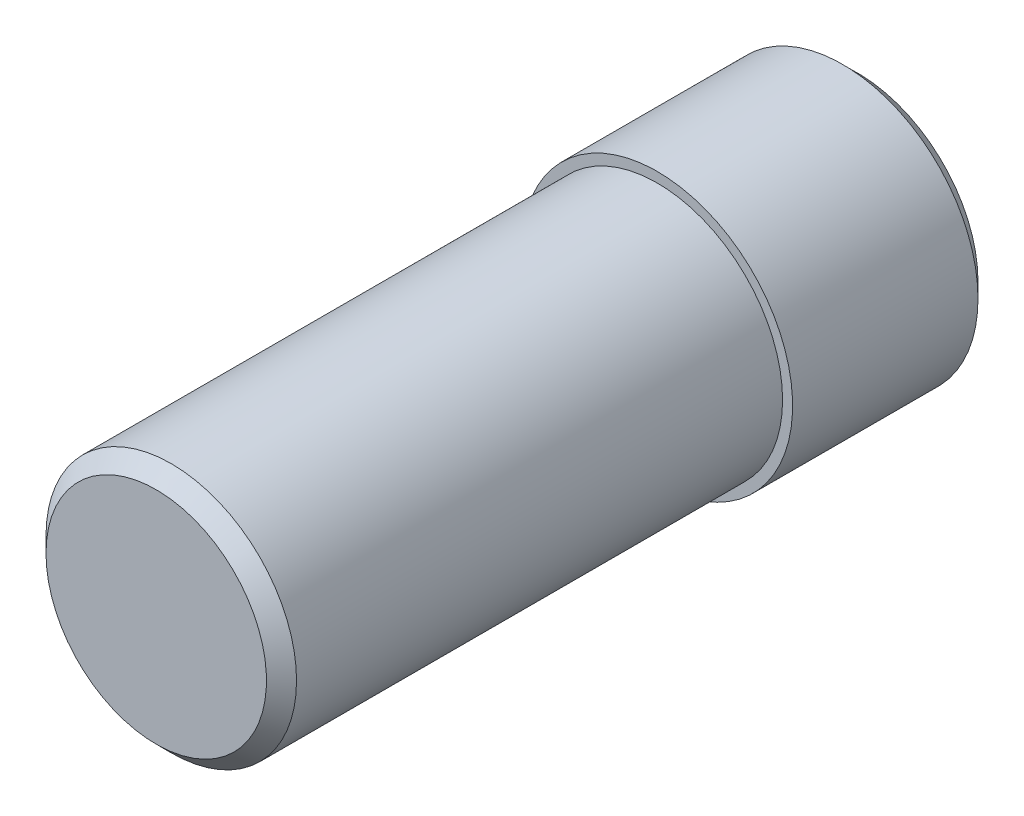
ISO-10303-21;
HEADER;
FILE_DESCRIPTION(('STEP AP214'),'2;1');
FILE_NAME('part.step','',(''),(''),'','','');
FILE_SCHEMA(('AUTOMOTIVE_DESIGN { 1 0 10303 214 1 1 1 1 }'));
ENDSEC;
DATA;
#1=APPLICATION_CONTEXT('core data for automotive mechanical design processes');
#2=APPLICATION_PROTOCOL_DEFINITION('international standard','automotive_design',2000,#1);
#3=PRODUCT_CONTEXT('',#1,'mechanical');
#4=PRODUCT('Part','Part','',(#3));
#5=PRODUCT_RELATED_PRODUCT_CATEGORY('part','',(#4));
#6=PRODUCT_DEFINITION_FORMATION('','',#4);
#7=PRODUCT_DEFINITION_CONTEXT('part definition',#1,'design');
#8=PRODUCT_DEFINITION('design','',#6,#7);
#9=PRODUCT_DEFINITION_SHAPE('','',#8);
#10=(LENGTH_UNIT() NAMED_UNIT(*) SI_UNIT(.MILLI.,.METRE.));
#11=(NAMED_UNIT(*) PLANE_ANGLE_UNIT() SI_UNIT($,.RADIAN.));
#12=(NAMED_UNIT(*) SI_UNIT($,.STERADIAN.) SOLID_ANGLE_UNIT());
#13=UNCERTAINTY_MEASURE_WITH_UNIT(LENGTH_MEASURE(1.E-05),#10,'distance_accuracy_value','');
#14=(GEOMETRIC_REPRESENTATION_CONTEXT(3) GLOBAL_UNCERTAINTY_ASSIGNED_CONTEXT((#13)) GLOBAL_UNIT_ASSIGNED_CONTEXT((#10,
#11,#12)) REPRESENTATION_CONTEXT('',''));
#15=CARTESIAN_POINT('',(0.,0.,0.));
#16=DIRECTION('',(0.,0.,1.));
#17=DIRECTION('',(1.,0.,0.));
#18=AXIS2_PLACEMENT_3D('',#15,#16,#17);
#19=CARTESIAN_POINT('',(-34.865256020568,6.05234446640857,-5.08));
#20=DIRECTION('',(0.,0.,-1.));
#21=DIRECTION('',(-1.,0.,0.));
#22=AXIS2_PLACEMENT_3D('',#19,#20,#21);
#23=PLANE('',#22);
#24=CARTESIAN_POINT('',(-34.865256020568,6.05234446640857,-5.079999999964));
#25=DIRECTION('',(0.,0.,1.));
#26=DIRECTION('',(1.,0.,0.));
#27=AXIS2_PLACEMENT_3D('',#24,#25,#26);
#28=CIRCLE('',#27,3.04800000003374);
#29=CARTESIAN_POINT('',(-31.8172560205342,6.05234446640857,-5.079999999964));
#30=VERTEX_POINT('',#29);
#31=EDGE_CURVE('E18',#30,#30,#28,.T.);
#32=ORIENTED_EDGE('',*,*,#31,.F.);
#33=EDGE_LOOP('',(#32));
#34=FACE_BOUND('',#33,.T.);
#35=ADVANCED_FACE('F15',(#34),#23,.T.);
#36=CARTESIAN_POINT('',(-34.865256020568,6.05234446640857,-4.69899999990275));
#37=DIRECTION('',(0.,0.,1.));
#38=DIRECTION('',(1.,0.,0.));
#39=AXIS2_PLACEMENT_3D('',#36,#37,#38);
#40=CONICAL_SURFACE('',#39,3.42900000009499,0.785398163397448);
#41=CARTESIAN_POINT('',(-34.865256020568,6.05234446640857,-4.699));
#42=DIRECTION('',(0.,0.,-1.));
#43=DIRECTION('',(-1.,0.,0.));
#44=AXIS2_PLACEMENT_3D('',#41,#42,#43);
#45=CIRCLE('',#44,3.429);
#46=CARTESIAN_POINT('',(-38.294256020568,6.05234446640857,-4.699));
#47=VERTEX_POINT('',#46);
#48=EDGE_CURVE('E32',#47,#47,#45,.F.);
#49=ORIENTED_EDGE('',*,*,#48,.F.);
#50=EDGE_LOOP('',(#49));
#51=FACE_BOUND('',#50,.T.);
#52=ORIENTED_EDGE('',*,*,#31,.T.);
#53=EDGE_LOOP('',(#52));
#54=FACE_BOUND('',#53,.T.);
#55=ADVANCED_FACE('F94',(#51,#54),#40,.T.);
#56=CARTESIAN_POINT('',(-34.865256020568,6.05234446640857,0.));
#57=DIRECTION('',(0.,0.,-1.));
#58=DIRECTION('',(-1.,0.,0.));
#59=AXIS2_PLACEMENT_3D('',#56,#57,#58);
#60=CYLINDRICAL_SURFACE('',#59,3.429);
#61=ORIENTED_EDGE('',*,*,#48,.T.);
#62=EDGE_LOOP('',(#61));
#63=FACE_BOUND('',#62,.T.);
#64=CARTESIAN_POINT('',(-34.865256020568,6.05234446640857,0.));
#65=DIRECTION('',(0.,0.,-1.));
#66=DIRECTION('',(-1.,0.,0.));
#67=AXIS2_PLACEMENT_3D('',#64,#65,#66);
#68=CIRCLE('',#67,3.429);
#69=CARTESIAN_POINT('',(-38.294256020568,6.05234446640857,0.));
#70=VERTEX_POINT('',#69);
#71=EDGE_CURVE('E35',#70,#70,#68,.T.);
#72=ORIENTED_EDGE('',*,*,#71,.T.);
#73=EDGE_LOOP('',(#72));
#74=FACE_BOUND('',#73,.T.);
#75=ADVANCED_FACE('F42',(#63,#74),#60,.T.);
#76=CARTESIAN_POINT('',(-34.865256020568,6.05234446640857,12.7));
#77=DIRECTION('',(0.,0.,-1.));
#78=DIRECTION('',(-1.,0.,0.));
#79=AXIS2_PLACEMENT_3D('',#76,#77,#78);
#80=PLANE('',#79);
#81=CARTESIAN_POINT('',(-34.865256020568,6.05234446640857,12.6999999999953));
#82=DIRECTION('',(0.,0.,-1.));
#83=DIRECTION('',(-1.,0.,0.));
#84=AXIS2_PLACEMENT_3D('',#81,#82,#83);
#85=CIRCLE('',#84,2.79400000004975);
#86=CARTESIAN_POINT('',(-37.6592560206177,6.05234446640857,12.6999999999953));
#87=VERTEX_POINT('',#86);
#88=EDGE_CURVE('E27',#87,#87,#85,.T.);
#89=ORIENTED_EDGE('',*,*,#88,.F.);
#90=EDGE_LOOP('',(#89));
#91=FACE_BOUND('',#90,.T.);
#92=ADVANCED_FACE('F47',(#91),#80,.F.);
#93=CARTESIAN_POINT('',(-34.865256020568,6.05234446640857,0.));
#94=DIRECTION('',(0.,0.,-1.));
#95=DIRECTION('',(-1.,0.,0.));
#96=AXIS2_PLACEMENT_3D('',#93,#94,#95);
#97=PLANE('',#96);
#98=CARTESIAN_POINT('',(-34.865256020568,6.05234446640857,0.));
#99=DIRECTION('',(0.,0.,1.));
#100=DIRECTION('',(1.,0.,0.));
#101=AXIS2_PLACEMENT_3D('',#98,#99,#100);
#102=CIRCLE('',#101,3.175);
#103=CARTESIAN_POINT('',(-31.690256020568,6.05234446640857,0.));
#104=VERTEX_POINT('',#103);
#105=EDGE_CURVE('E22',#104,#104,#102,.T.);
#106=ORIENTED_EDGE('',*,*,#105,.F.);
#107=EDGE_LOOP('',(#106));
#108=FACE_BOUND('',#107,.T.);
#109=ORIENTED_EDGE('',*,*,#71,.F.);
#110=EDGE_LOOP('',(#109));
#111=FACE_BOUND('',#110,.T.);
#112=ADVANCED_FACE('F44',(#108,#111),#97,.F.);
#113=CARTESIAN_POINT('',(-34.865256020568,6.05234446640857,12.3189999999909));
#114=DIRECTION('',(0.,0.,-1.));
#115=DIRECTION('',(-1.,0.,0.));
#116=AXIS2_PLACEMENT_3D('',#113,#114,#115);
#117=CONICAL_SURFACE('',#116,3.17500000005416,0.785398163397448);
#118=CARTESIAN_POINT('',(-34.865256020568,6.05234446640857,12.319));
#119=DIRECTION('',(0.,0.,1.));
#120=DIRECTION('',(1.,0.,0.));
#121=AXIS2_PLACEMENT_3D('',#118,#119,#120);
#122=CIRCLE('',#121,3.175);
#123=CARTESIAN_POINT('',(-31.690256020568,6.05234446640857,12.319));
#124=VERTEX_POINT('',#123);
#125=EDGE_CURVE('E10',#124,#124,#122,.F.);
#126=ORIENTED_EDGE('',*,*,#125,.F.);
#127=EDGE_LOOP('',(#126));
#128=FACE_BOUND('',#127,.T.);
#129=ORIENTED_EDGE('',*,*,#88,.T.);
#130=EDGE_LOOP('',(#129));
#131=FACE_BOUND('',#130,.T.);
#132=ADVANCED_FACE('F46',(#128,#131),#117,.T.);
#133=CARTESIAN_POINT('',(-34.865256020568,6.05234446640857,0.));
#134=DIRECTION('',(0.,0.,1.));
#135=DIRECTION('',(1.,0.,0.));
#136=AXIS2_PLACEMENT_3D('',#133,#134,#135);
#137=CYLINDRICAL_SURFACE('',#136,3.175);
#138=ORIENTED_EDGE('',*,*,#125,.T.);
#139=EDGE_LOOP('',(#138));
#140=FACE_BOUND('',#139,.T.);
#141=ORIENTED_EDGE('',*,*,#105,.T.);
#142=EDGE_LOOP('',(#141));
#143=FACE_BOUND('',#142,.T.);
#144=ADVANCED_FACE('F55',(#140,#143),#137,.T.);
#145=CLOSED_SHELL('',(#35,#55,#75,#92,#112,#132,#144));
#146=MANIFOLD_SOLID_BREP('B1',#145);
#147=ADVANCED_BREP_SHAPE_REPRESENTATION('',(#18,#146),#14);
#148=SHAPE_DEFINITION_REPRESENTATION(#9,#147);
ENDSEC;
END-ISO-10303-21;
